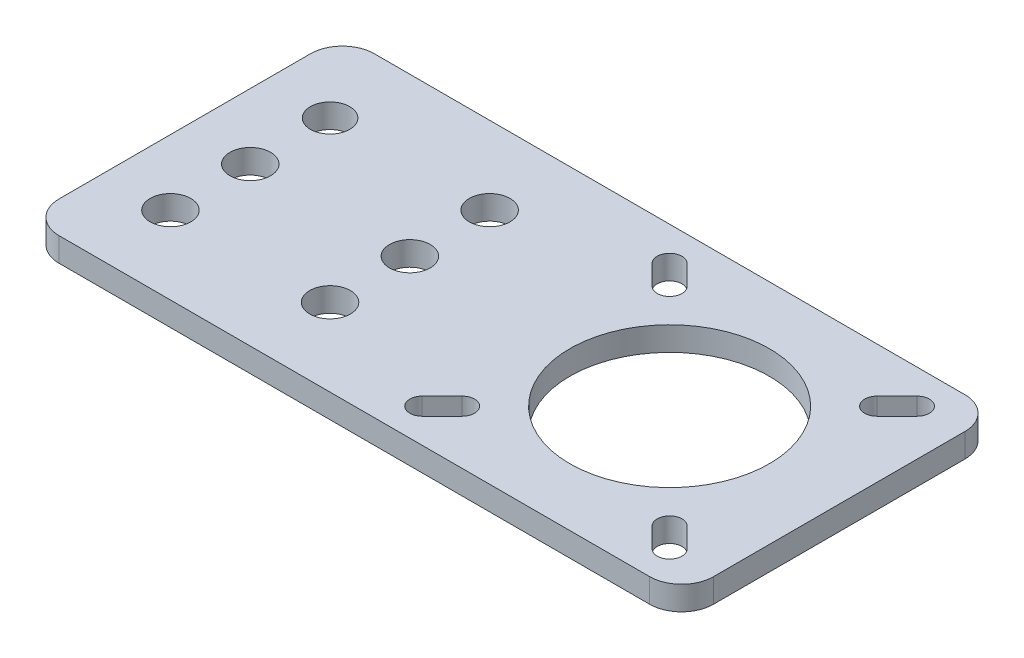
ISO-10303-21;
HEADER;
FILE_DESCRIPTION(('STEP AP214'),'2;1');
FILE_NAME('part.step','',(''),(''),'','','');
FILE_SCHEMA(('AUTOMOTIVE_DESIGN { 1 0 10303 214 1 1 1 1 }'));
ENDSEC;
DATA;
#1=APPLICATION_CONTEXT('core data for automotive mechanical design processes');
#2=APPLICATION_PROTOCOL_DEFINITION('international standard','automotive_design',2000,#1);
#3=PRODUCT_CONTEXT('',#1,'mechanical');
#4=PRODUCT('Part','Part','',(#3));
#5=PRODUCT_RELATED_PRODUCT_CATEGORY('part','',(#4));
#6=PRODUCT_DEFINITION_FORMATION('','',#4);
#7=PRODUCT_DEFINITION_CONTEXT('part definition',#1,'design');
#8=PRODUCT_DEFINITION('design','',#6,#7);
#9=PRODUCT_DEFINITION_SHAPE('','',#8);
#10=(LENGTH_UNIT() NAMED_UNIT(*) SI_UNIT(.MILLI.,.METRE.));
#11=(NAMED_UNIT(*) PLANE_ANGLE_UNIT() SI_UNIT($,.RADIAN.));
#12=(NAMED_UNIT(*) SI_UNIT($,.STERADIAN.) SOLID_ANGLE_UNIT());
#13=UNCERTAINTY_MEASURE_WITH_UNIT(LENGTH_MEASURE(1.E-05),#10,'distance_accuracy_value','');
#14=(GEOMETRIC_REPRESENTATION_CONTEXT(3) GLOBAL_UNCERTAINTY_ASSIGNED_CONTEXT((#13)) GLOBAL_UNIT_ASSIGNED_CONTEXT((#10,
#11,#12)) REPRESENTATION_CONTEXT('',''));
#15=CARTESIAN_POINT('',(0.,0.,0.));
#16=DIRECTION('',(0.,0.,1.));
#17=DIRECTION('',(1.,0.,0.));
#18=AXIS2_PLACEMENT_3D('',#15,#16,#17);
#19=CARTESIAN_POINT('',(-16.9138230966285,2.99999999999812,-24.8818430543195));
#20=DIRECTION('',(0.,1.,0.));
#21=DIRECTION('',(0.,0.,1.));
#22=AXIS2_PLACEMENT_3D('',#19,#20,#21);
#23=PLANE('',#22);
#24=DIRECTION('',(-0.707106781186549,0.,0.70710678118655));
#25=VECTOR('',#24,1.);
#26=CARTESIAN_POINT('',(54.2401613925318,2.99999999999812,-25.7278585651587));
#27=LINE('',#26,#25);
#28=CARTESIAN_POINT('',(54.2401613925318,2.99999999999812,-25.7278585651587));
#29=VERTEX_POINT('',#28);
#30=CARTESIAN_POINT('',(51.7401613925318,3.,-23.2278585651587));
#31=VERTEX_POINT('',#30);
#32=EDGE_CURVE('E601',#29,#31,#27,.T.);
#33=ORIENTED_EDGE('',*,*,#32,.F.);
#34=CARTESIAN_POINT('',(55.3361769033705,2.99999999999812,-24.6318430543195));
#35=DIRECTION('',(0.,1.,0.));
#36=DIRECTION('',(0.,0.,1.));
#37=AXIS2_PLACEMENT_3D('',#34,#35,#36);
#38=CIRCLE('',#37,1.55);
#39=CARTESIAN_POINT('',(56.4321924142097,3.,-23.5358275434812));
#40=VERTEX_POINT('',#39);
#41=EDGE_CURVE('E592',#40,#29,#38,.T.);
#42=ORIENTED_EDGE('',*,*,#41,.F.);
#43=DIRECTION('',(-0.707106781186553,0.,0.707106781186546));
#44=VECTOR('',#43,1.);
#45=CARTESIAN_POINT('',(56.4321924142097,3.,-23.5358275434812));
#46=LINE('',#45,#44);
#47=CARTESIAN_POINT('',(53.9321924142097,2.99999999999812,-21.0358275434803));
#48=VERTEX_POINT('',#47);
#49=EDGE_CURVE('E620',#40,#48,#46,.T.);
#50=ORIENTED_EDGE('',*,*,#49,.T.);
#51=CARTESIAN_POINT('',(52.8361769033705,3.,-22.1318430543204));
#52=DIRECTION('',(0.,1.,0.));
#53=DIRECTION('',(0.,0.,1.));
#54=AXIS2_PLACEMENT_3D('',#51,#52,#53);
#55=CIRCLE('',#54,1.54999999999999);
#56=EDGE_CURVE('E615',#31,#48,#55,.T.);
#57=ORIENTED_EDGE('',*,*,#56,.F.);
#58=EDGE_LOOP('',(#33,#42,#50,#57));
#59=FACE_BOUND('',#58,.T.);
#60=DIRECTION('',(0.707106781186542,0.,0.707106781186557));
#61=VECTOR('',#60,1.);
#62=CARTESIAN_POINT('',(23.2401613925324,2.99999999999812,-23.5358275434802));
#63=LINE('',#62,#61);
#64=CARTESIAN_POINT('',(23.2401613925324,2.99999999999812,-23.5358275434802));
#65=VERTEX_POINT('',#64);
#66=CARTESIAN_POINT('',(25.7401613925315,2.99999999999812,-21.0358275434802));
#67=VERTEX_POINT('',#66);
#68=EDGE_CURVE('E689',#65,#67,#63,.T.);
#69=ORIENTED_EDGE('',*,*,#68,.F.);
#70=CARTESIAN_POINT('',(24.3361769033698,3.,-24.6318430543193));
#71=DIRECTION('',(0.,1.,0.));
#72=DIRECTION('',(0.,0.,1.));
#73=AXIS2_PLACEMENT_3D('',#70,#71,#72);
#74=CIRCLE('',#73,1.55);
#75=CARTESIAN_POINT('',(25.4321924142099,2.99999999999812,-25.7278585651585));
#76=VERTEX_POINT('',#75);
#77=EDGE_CURVE('E686',#76,#65,#74,.T.);
#78=ORIENTED_EDGE('',*,*,#77,.F.);
#79=DIRECTION('',(0.707106781186539,0.,0.70710678118656));
#80=VECTOR('',#79,1.);
#81=CARTESIAN_POINT('',(25.4321924142099,2.99999999999812,-25.7278585651585));
#82=LINE('',#81,#80);
#83=CARTESIAN_POINT('',(27.9321924142098,3.,-23.2278585651594));
#84=VERTEX_POINT('',#83);
#85=EDGE_CURVE('E697',#76,#84,#82,.T.);
#86=ORIENTED_EDGE('',*,*,#85,.T.);
#87=CARTESIAN_POINT('',(26.8361769033697,3.,-22.1318430543193));
#88=DIRECTION('',(0.,1.,0.));
#89=DIRECTION('',(0.,0.,1.));
#90=AXIS2_PLACEMENT_3D('',#87,#88,#89);
#91=CIRCLE('',#90,1.54999999999999);
#92=EDGE_CURVE('E693',#67,#84,#91,.T.);
#93=ORIENTED_EDGE('',*,*,#92,.F.);
#94=EDGE_LOOP('',(#69,#78,#86,#93));
#95=FACE_BOUND('',#94,.T.);
#96=DIRECTION('',(0.707106781186554,0.,-0.707106781186545));
#97=VECTOR('',#96,1.);
#98=CARTESIAN_POINT('',(25.432192414209,2.99999999999812,7.46417245651987));
#99=LINE('',#98,#97);
#100=CARTESIAN_POINT('',(25.432192414209,2.99999999999812,7.46417245651987));
#101=VERTEX_POINT('',#100);
#102=CARTESIAN_POINT('',(27.9321924142099,3.,4.96417245651992));
#103=VERTEX_POINT('',#102);
#104=EDGE_CURVE('E733',#101,#103,#99,.T.);
#105=ORIENTED_EDGE('',*,*,#104,.F.);
#106=CARTESIAN_POINT('',(24.3361769033708,2.99999999999812,6.36815694568071));
#107=DIRECTION('',(0.,1.,0.));
#108=DIRECTION('',(0.,0.,1.));
#109=AXIS2_PLACEMENT_3D('',#106,#107,#108);
#110=CIRCLE('',#109,1.55);
#111=CARTESIAN_POINT('',(23.2401613925316,3.,5.27214143484062));
#112=VERTEX_POINT('',#111);
#113=EDGE_CURVE('E730',#112,#101,#110,.T.);
#114=ORIENTED_EDGE('',*,*,#113,.F.);
#115=DIRECTION('',(0.707106781186558,0.,-0.707106781186541));
#116=VECTOR('',#115,1.);
#117=CARTESIAN_POINT('',(23.2401613925316,3.,5.27214143484062));
#118=LINE('',#117,#116);
#119=CARTESIAN_POINT('',(25.7401613925307,2.99999999999812,2.77214143484067));
#120=VERTEX_POINT('',#119);
#121=EDGE_CURVE('E741',#112,#120,#118,.T.);
#122=ORIENTED_EDGE('',*,*,#121,.T.);
#123=CARTESIAN_POINT('',(26.8361769033699,3.,3.86815694568077));
#124=DIRECTION('',(0.,1.,0.));
#125=DIRECTION('',(0.,0.,1.));
#126=AXIS2_PLACEMENT_3D('',#123,#124,#125);
#127=CIRCLE('',#126,1.54999999999999);
#128=EDGE_CURVE('E737',#103,#120,#127,.T.);
#129=ORIENTED_EDGE('',*,*,#128,.F.);
#130=EDGE_LOOP('',(#105,#114,#122,#129));
#131=FACE_BOUND('',#130,.T.);
#132=CARTESIAN_POINT('',(7.28617690337052,2.99999999999812,-9.13184305431952));
#133=DIRECTION('',(0.,1.,0.));
#134=DIRECTION('',(0.,0.,1.));
#135=AXIS2_PLACEMENT_3D('',#132,#133,#134);
#136=CIRCLE('',#135,2.55);
#137=CARTESIAN_POINT('',(7.28617690337052,2.99999999999811,-6.58184305431951));
#138=VERTEX_POINT('',#137);
#139=EDGE_CURVE('E774',#138,#138,#136,.T.);
#140=ORIENTED_EDGE('',*,*,#139,.F.);
#141=EDGE_LOOP('',(#140));
#142=FACE_BOUND('',#141,.T.);
#143=CARTESIAN_POINT('',(-12.7138230966295,3.,0.868156945679543));
#144=DIRECTION('',(0.,1.,0.));
#145=DIRECTION('',(0.,0.,1.));
#146=AXIS2_PLACEMENT_3D('',#143,#144,#145);
#147=CIRCLE('',#146,2.55);
#148=CARTESIAN_POINT('',(-12.7138230966295,3.,3.41815694567955));
#149=VERTEX_POINT('',#148);
#150=EDGE_CURVE('E790',#149,#149,#147,.T.);
#151=ORIENTED_EDGE('',*,*,#150,.F.);
#152=EDGE_LOOP('',(#151));
#153=FACE_BOUND('',#152,.T.);
#154=CARTESIAN_POINT('',(-12.7138230966294,2.99999999999812,-19.1318430543204));
#155=DIRECTION('',(0.,1.,0.));
#156=DIRECTION('',(0.,0.,1.));
#157=AXIS2_PLACEMENT_3D('',#154,#155,#156);
#158=CIRCLE('',#157,2.46670415646697);
#159=CARTESIAN_POINT('',(-12.7138230966294,2.99999999999811,-16.6651388978534));
#160=VERTEX_POINT('',#159);
#161=EDGE_CURVE('E806',#160,#160,#158,.T.);
#162=ORIENTED_EDGE('',*,*,#161,.F.);
#163=EDGE_LOOP('',(#162));
#164=FACE_BOUND('',#163,.T.);
#165=CARTESIAN_POINT('',(-16.9138230966285,2.99999999999812,-24.8818430543195));
#166=DIRECTION('',(0.,1.,0.));
#167=DIRECTION('',(0.,0.,1.));
#168=AXIS2_PLACEMENT_3D('',#165,#166,#167);
#169=CIRCLE('',#168,4.);
#170=CARTESIAN_POINT('',(-16.9138230966295,3.,-28.8818430543195));
#171=VERTEX_POINT('',#170);
#172=CARTESIAN_POINT('',(-20.9138230966304,3.,-24.8818430543195));
#173=VERTEX_POINT('',#172);
#174=EDGE_CURVE('E822',#171,#173,#169,.T.);
#175=ORIENTED_EDGE('',*,*,#174,.T.);
#176=DIRECTION('',(0.,0.,1.));
#177=VECTOR('',#176,1.);
#178=CARTESIAN_POINT('',(-20.9138230966304,3.,-24.8818430543195));
#179=LINE('',#178,#177);
#180=CARTESIAN_POINT('',(-20.9138230966304,3.,6.61815694568052));
#181=VERTEX_POINT('',#180);
#182=EDGE_CURVE('E826',#173,#181,#179,.T.);
#183=ORIENTED_EDGE('',*,*,#182,.T.);
#184=CARTESIAN_POINT('',(-16.9138230966285,3.,6.61815694568046));
#185=DIRECTION('',(0.,-1.,0.));
#186=DIRECTION('',(0.,0.,-1.));
#187=AXIS2_PLACEMENT_3D('',#184,#185,#186);
#188=CIRCLE('',#187,4.);
#189=CARTESIAN_POINT('',(-16.9138230966295,3.,10.6181569456805));
#190=VERTEX_POINT('',#189);
#191=EDGE_CURVE('E830',#190,#181,#188,.T.);
#192=ORIENTED_EDGE('',*,*,#191,.F.);
#193=DIRECTION('',(1.,0.,0.));
#194=VECTOR('',#193,1.);
#195=CARTESIAN_POINT('',(-16.9138230966295,3.,10.6181569456805));
#196=LINE('',#195,#194);
#197=CARTESIAN_POINT('',(57.086176903371,3.,10.6181569456795));
#198=VERTEX_POINT('',#197);
#199=EDGE_CURVE('E834',#190,#198,#196,.T.);
#200=ORIENTED_EDGE('',*,*,#199,.T.);
#201=CARTESIAN_POINT('',(57.0861769033705,2.99999999999812,6.61815694568046));
#202=DIRECTION('',(0.,1.,0.));
#203=DIRECTION('',(0.,0.,1.));
#204=AXIS2_PLACEMENT_3D('',#201,#202,#203);
#205=CIRCLE('',#204,4.);
#206=CARTESIAN_POINT('',(61.0861769033705,2.99999999999812,6.61815694567958));
#207=VERTEX_POINT('',#206);
#208=EDGE_CURVE('E837',#198,#207,#205,.T.);
#209=ORIENTED_EDGE('',*,*,#208,.T.);
#210=DIRECTION('',(0.,0.,1.));
#211=VECTOR('',#210,1.);
#212=CARTESIAN_POINT('',(61.0861769033706,3.,-24.8818430543205));
#213=LINE('',#212,#211);
#214=CARTESIAN_POINT('',(61.0861769033706,3.,-24.8818430543205));
#215=VERTEX_POINT('',#214);
#216=EDGE_CURVE('E840',#215,#207,#213,.T.);
#217=ORIENTED_EDGE('',*,*,#216,.F.);
#218=CARTESIAN_POINT('',(57.086176903371,2.99999999999812,-24.8818430543204));
#219=DIRECTION('',(0.,1.,0.));
#220=DIRECTION('',(0.,0.,1.));
#221=AXIS2_PLACEMENT_3D('',#218,#219,#220);
#222=CIRCLE('',#221,4.);
#223=CARTESIAN_POINT('',(57.0861769033705,3.,-28.8818430543205));
#224=VERTEX_POINT('',#223);
#225=EDGE_CURVE('E844',#215,#224,#222,.T.);
#226=ORIENTED_EDGE('',*,*,#225,.T.);
#227=DIRECTION('',(1.,0.,0.));
#228=VECTOR('',#227,1.);
#229=CARTESIAN_POINT('',(-16.9138230966295,3.,-28.8818430543195));
#230=LINE('',#229,#228);
#231=EDGE_CURVE('E847',#171,#224,#230,.T.);
#232=ORIENTED_EDGE('',*,*,#231,.F.);
#233=EDGE_LOOP('',(#175,#183,#192,#200,#209,#217,#226,#232));
#234=FACE_BOUND('',#233,.T.);
#235=CARTESIAN_POINT('',(7.28617690337052,3.,-19.1318430543195));
#236=DIRECTION('',(0.,1.,0.));
#237=DIRECTION('',(0.,0.,1.));
#238=AXIS2_PLACEMENT_3D('',#235,#236,#237);
#239=CIRCLE('',#238,2.55);
#240=CARTESIAN_POINT('',(7.28617690337052,3.,-16.5818430543195));
#241=VERTEX_POINT('',#240);
#242=EDGE_CURVE('E814',#241,#241,#239,.T.);
#243=ORIENTED_EDGE('',*,*,#242,.F.);
#244=EDGE_LOOP('',(#243));
#245=FACE_BOUND('',#244,.T.);
#246=CARTESIAN_POINT('',(-12.7138230966295,3.,-9.13184305431952));
#247=DIRECTION('',(0.,1.,0.));
#248=DIRECTION('',(0.,0.,1.));
#249=AXIS2_PLACEMENT_3D('',#246,#247,#248);
#250=CIRCLE('',#249,2.55);
#251=CARTESIAN_POINT('',(-12.7138230966295,3.,-6.58184305431951));
#252=VERTEX_POINT('',#251);
#253=EDGE_CURVE('E798',#252,#252,#250,.T.);
#254=ORIENTED_EDGE('',*,*,#253,.F.);
#255=EDGE_LOOP('',(#254));
#256=FACE_BOUND('',#255,.T.);
#257=CARTESIAN_POINT('',(7.28617690337052,2.99999999999812,0.868156945680487));
#258=DIRECTION('',(0.,1.,0.));
#259=DIRECTION('',(0.,0.,1.));
#260=AXIS2_PLACEMENT_3D('',#257,#258,#259);
#261=CIRCLE('',#260,2.55);
#262=CARTESIAN_POINT('',(7.28617690337052,2.99999999999811,3.4181569456805));
#263=VERTEX_POINT('',#262);
#264=EDGE_CURVE('E782',#263,#263,#261,.T.);
#265=ORIENTED_EDGE('',*,*,#264,.F.);
#266=EDGE_LOOP('',(#265));
#267=FACE_BOUND('',#266,.T.);
#268=CARTESIAN_POINT('',(55.3361769033705,3.,6.36815694567955));
#269=DIRECTION('',(0.,-1.,0.));
#270=DIRECTION('',(0.,0.,-1.));
#271=AXIS2_PLACEMENT_3D('',#268,#269,#270);
#272=CIRCLE('',#271,1.54999999999999);
#273=CARTESIAN_POINT('',(56.4321924142097,2.99999999999812,5.27214143484134));
#274=VERTEX_POINT('',#273);
#275=CARTESIAN_POINT('',(54.2401613925318,2.99999999999812,7.46417245651959));
#276=VERTEX_POINT('',#275);
#277=EDGE_CURVE('E643',#274,#276,#272,.T.);
#278=ORIENTED_EDGE('',*,*,#277,.T.);
#279=DIRECTION('',(-0.707106781186549,0.,-0.70710678118655));
#280=VECTOR('',#279,1.);
#281=CARTESIAN_POINT('',(54.2401613925318,2.99999999999812,7.46417245651959));
#282=LINE('',#281,#280);
#283=CARTESIAN_POINT('',(51.7401613925319,3.,4.96417245651964));
#284=VERTEX_POINT('',#283);
#285=EDGE_CURVE('E647',#276,#284,#282,.T.);
#286=ORIENTED_EDGE('',*,*,#285,.T.);
#287=CARTESIAN_POINT('',(52.836176903371,2.99999999999812,3.86815694568049));
#288=DIRECTION('',(0.,-1.,0.));
#289=DIRECTION('',(0.,0.,-1.));
#290=AXIS2_PLACEMENT_3D('',#287,#288,#289);
#291=CIRCLE('',#290,1.54999999999999);
#292=CARTESIAN_POINT('',(53.9321924142097,2.99999999999812,2.77214143484134));
#293=VERTEX_POINT('',#292);
#294=EDGE_CURVE('E652',#284,#293,#291,.T.);
#295=ORIENTED_EDGE('',*,*,#294,.T.);
#296=DIRECTION('',(-0.707106781186549,0.,-0.70710678118655));
#297=VECTOR('',#296,1.);
#298=CARTESIAN_POINT('',(56.4321924142097,2.99999999999812,5.27214143484134));
#299=LINE('',#298,#297);
#300=EDGE_CURVE('E656',#274,#293,#299,.T.);
#301=ORIENTED_EDGE('',*,*,#300,.F.);
#302=EDGE_LOOP('',(#278,#286,#295,#301));
#303=FACE_BOUND('',#302,.T.);
#304=CARTESIAN_POINT('',(39.8361769033705,2.99999999999812,-9.13184305431952));
#305=DIRECTION('',(0.,1.,0.));
#306=DIRECTION('',(0.,0.,1.));
#307=AXIS2_PLACEMENT_3D('',#304,#305,#306);
#308=CIRCLE('',#307,12.5);
#309=CARTESIAN_POINT('',(39.8361769033705,2.99999999999808,3.36815694568053));
#310=VERTEX_POINT('',#309);
#311=EDGE_CURVE('E628',#310,#310,#308,.T.);
#312=ORIENTED_EDGE('',*,*,#311,.F.);
#313=EDGE_LOOP('',(#312));
#314=FACE_BOUND('',#313,.T.);
#315=ADVANCED_FACE('F430',(#59,#95,#131,#142,#153,#164,#234,#245,#256,#267,#303,#314),#23,.T.);
#316=CARTESIAN_POINT('',(-16.9138230966285,-1.88737914186277E-12,-24.8818430543186));
#317=DIRECTION('',(0.,1.,0.));
#318=DIRECTION('',(0.,0.,1.));
#319=AXIS2_PLACEMENT_3D('',#316,#317,#318);
#320=PLANE('',#319);
#321=CARTESIAN_POINT('',(24.3361769033698,0.,-24.6318430543184));
#322=DIRECTION('',(0.,1.,0.));
#323=DIRECTION('',(0.,0.,1.));
#324=AXIS2_PLACEMENT_3D('',#321,#322,#323);
#325=CIRCLE('',#324,1.55);
#326=CARTESIAN_POINT('',(25.4321924142099,-1.88737914186277E-12,-25.7278585651575));
#327=VERTEX_POINT('',#326);
#328=CARTESIAN_POINT('',(23.2401613925324,-1.88737914186277E-12,-23.5358275434802));
#329=VERTEX_POINT('',#328);
#330=EDGE_CURVE('E676',#327,#329,#325,.T.);
#331=ORIENTED_EDGE('',*,*,#330,.T.);
#332=DIRECTION('',(0.707106781186542,0.,0.707106781186557));
#333=VECTOR('',#332,1.);
#334=CARTESIAN_POINT('',(23.2401613925324,-1.88737914186277E-12,-23.5358275434802));
#335=LINE('',#334,#333);
#336=CARTESIAN_POINT('',(25.7401613925315,-1.88737914186277E-12,-21.0358275434792));
#337=VERTEX_POINT('',#336);
#338=EDGE_CURVE('E705',#329,#337,#335,.T.);
#339=ORIENTED_EDGE('',*,*,#338,.T.);
#340=CARTESIAN_POINT('',(26.8361769033697,0.,-22.1318430543184));
#341=DIRECTION('',(0.,1.,0.));
#342=DIRECTION('',(0.,0.,1.));
#343=AXIS2_PLACEMENT_3D('',#340,#341,#342);
#344=CIRCLE('',#343,1.54999999999999);
#345=CARTESIAN_POINT('',(27.9321924142098,0.,-23.2278585651584));
#346=VERTEX_POINT('',#345);
#347=EDGE_CURVE('E709',#337,#346,#344,.T.);
#348=ORIENTED_EDGE('',*,*,#347,.T.);
#349=DIRECTION('',(0.707106781186539,0.,0.70710678118656));
#350=VECTOR('',#349,1.);
#351=CARTESIAN_POINT('',(25.4321924142099,-1.88737914186277E-12,-25.7278585651575));
#352=LINE('',#351,#350);
#353=EDGE_CURVE('E690',#327,#346,#352,.T.);
#354=ORIENTED_EDGE('',*,*,#353,.F.);
#355=EDGE_LOOP('',(#331,#339,#348,#354));
#356=FACE_BOUND('',#355,.T.);
#357=CARTESIAN_POINT('',(7.28617690337052,-1.88737914186277E-12,-9.13184305431952));
#358=DIRECTION('',(0.,1.,0.));
#359=DIRECTION('',(0.,0.,1.));
#360=AXIS2_PLACEMENT_3D('',#357,#358,#359);
#361=CIRCLE('',#360,2.55);
#362=CARTESIAN_POINT('',(7.28617690337052,-1.8946002965091E-12,-6.58184305431951));
#363=VERTEX_POINT('',#362);
#364=EDGE_CURVE('E773',#363,#363,#361,.T.);
#365=ORIENTED_EDGE('',*,*,#364,.T.);
#366=EDGE_LOOP('',(#365));
#367=FACE_BOUND('',#366,.T.);
#368=CARTESIAN_POINT('',(7.28617690337052,-1.88737914186277E-12,0.868156945681375));
#369=DIRECTION('',(0.,1.,0.));
#370=DIRECTION('',(0.,0.,1.));
#371=AXIS2_PLACEMENT_3D('',#368,#369,#370);
#372=CIRCLE('',#371,2.55);
#373=CARTESIAN_POINT('',(7.28617690337052,-1.8946002965091E-12,3.41815694568139));
#374=VERTEX_POINT('',#373);
#375=EDGE_CURVE('E778',#374,#374,#372,.T.);
#376=ORIENTED_EDGE('',*,*,#375,.T.);
#377=EDGE_LOOP('',(#376));
#378=FACE_BOUND('',#377,.T.);
#379=CARTESIAN_POINT('',(-12.7138230966295,0.,0.868156945680487));
#380=DIRECTION('',(0.,1.,0.));
#381=DIRECTION('',(0.,0.,1.));
#382=AXIS2_PLACEMENT_3D('',#379,#380,#381);
#383=CIRCLE('',#382,2.55);
#384=CARTESIAN_POINT('',(-12.7138230966295,0.,3.4181569456805));
#385=VERTEX_POINT('',#384);
#386=EDGE_CURVE('E786',#385,#385,#383,.T.);
#387=ORIENTED_EDGE('',*,*,#386,.T.);
#388=EDGE_LOOP('',(#387));
#389=FACE_BOUND('',#388,.T.);
#390=CARTESIAN_POINT('',(-12.7138230966295,0.,-9.13184305431858));
#391=DIRECTION('',(0.,1.,0.));
#392=DIRECTION('',(0.,0.,1.));
#393=AXIS2_PLACEMENT_3D('',#390,#391,#392);
#394=CIRCLE('',#393,2.55);
#395=CARTESIAN_POINT('',(-12.7138230966295,0.,-6.58184305431857));
#396=VERTEX_POINT('',#395);
#397=EDGE_CURVE('E794',#396,#396,#394,.T.);
#398=ORIENTED_EDGE('',*,*,#397,.T.);
#399=EDGE_LOOP('',(#398));
#400=FACE_BOUND('',#399,.T.);
#401=CARTESIAN_POINT('',(-12.7138230966294,-1.88737914186277E-12,-19.1318430543195));
#402=DIRECTION('',(0.,1.,0.));
#403=DIRECTION('',(0.,0.,1.));
#404=AXIS2_PLACEMENT_3D('',#401,#402,#403);
#405=CIRCLE('',#404,2.46670415646697);
#406=CARTESIAN_POINT('',(-12.7138230966294,-1.89436441722771E-12,-16.6651388978526));
#407=VERTEX_POINT('',#406);
#408=EDGE_CURVE('E802',#407,#407,#405,.T.);
#409=ORIENTED_EDGE('',*,*,#408,.T.);
#410=EDGE_LOOP('',(#409));
#411=FACE_BOUND('',#410,.T.);
#412=CARTESIAN_POINT('',(7.28617690337052,0.,-19.1318430543185));
#413=DIRECTION('',(0.,1.,0.));
#414=DIRECTION('',(0.,0.,1.));
#415=AXIS2_PLACEMENT_3D('',#412,#413,#414);
#416=CIRCLE('',#415,2.55);
#417=CARTESIAN_POINT('',(7.28617690337052,0.,-16.5818430543185));
#418=VERTEX_POINT('',#417);
#419=EDGE_CURVE('E810',#418,#418,#416,.T.);
#420=ORIENTED_EDGE('',*,*,#419,.T.);
#421=EDGE_LOOP('',(#420));
#422=FACE_BOUND('',#421,.T.);
#423=CARTESIAN_POINT('',(-16.9138230966285,-1.88737914186277E-12,-24.8818430543186));
#424=DIRECTION('',(0.,1.,0.));
#425=DIRECTION('',(0.,0.,1.));
#426=AXIS2_PLACEMENT_3D('',#423,#424,#425);
#427=CIRCLE('',#426,4.);
#428=CARTESIAN_POINT('',(-16.9138230966295,0.,-28.8818430543186));
#429=VERTEX_POINT('',#428);
#430=CARTESIAN_POINT('',(-20.9138230966304,0.,-24.8818430543186));
#431=VERTEX_POINT('',#430);
#432=EDGE_CURVE('E818',#429,#431,#427,.T.);
#433=ORIENTED_EDGE('',*,*,#432,.F.);
#434=DIRECTION('',(1.,0.,0.));
#435=VECTOR('',#434,1.);
#436=CARTESIAN_POINT('',(-16.9138230966295,0.,-28.8818430543186));
#437=LINE('',#436,#435);
#438=CARTESIAN_POINT('',(57.0861769033705,0.,-28.8818430543195));
#439=VERTEX_POINT('',#438);
#440=EDGE_CURVE('E827',#429,#439,#437,.T.);
#441=ORIENTED_EDGE('',*,*,#440,.T.);
#442=CARTESIAN_POINT('',(57.086176903371,-1.88737914186277E-12,-24.8818430543195));
#443=DIRECTION('',(0.,1.,0.));
#444=DIRECTION('',(0.,0.,1.));
#445=AXIS2_PLACEMENT_3D('',#442,#443,#444);
#446=CIRCLE('',#445,4.);
#447=CARTESIAN_POINT('',(61.0861769033706,0.,-24.8818430543195));
#448=VERTEX_POINT('',#447);
#449=EDGE_CURVE('E874',#448,#439,#446,.T.);
#450=ORIENTED_EDGE('',*,*,#449,.F.);
#451=DIRECTION('',(0.,0.,1.));
#452=VECTOR('',#451,1.);
#453=CARTESIAN_POINT('',(61.0861769033706,0.,-24.8818430543195));
#454=LINE('',#453,#452);
#455=CARTESIAN_POINT('',(61.0861769033705,-1.88737914186277E-12,6.61815694568052));
#456=VERTEX_POINT('',#455);
#457=EDGE_CURVE('E870',#448,#456,#454,.T.);
#458=ORIENTED_EDGE('',*,*,#457,.T.);
#459=CARTESIAN_POINT('',(57.0861769033705,-1.88737914186277E-12,6.61815694568052));
#460=DIRECTION('',(0.,1.,0.));
#461=DIRECTION('',(0.,0.,1.));
#462=AXIS2_PLACEMENT_3D('',#459,#460,#461);
#463=CIRCLE('',#462,4.);
#464=CARTESIAN_POINT('',(57.086176903371,0.,10.6181569456805));
#465=VERTEX_POINT('',#464);
#466=EDGE_CURVE('E866',#465,#456,#463,.T.);
#467=ORIENTED_EDGE('',*,*,#466,.F.);
#468=DIRECTION('',(1.,0.,0.));
#469=VECTOR('',#468,1.);
#470=CARTESIAN_POINT('',(-16.9138230966295,0.,10.6181569456815));
#471=LINE('',#470,#469);
#472=CARTESIAN_POINT('',(-16.9138230966295,0.,10.6181569456815));
#473=VERTEX_POINT('',#472);
#474=EDGE_CURVE('E863',#473,#465,#471,.T.);
#475=ORIENTED_EDGE('',*,*,#474,.F.);
#476=CARTESIAN_POINT('',(-16.9138230966285,0.,6.61815694568141));
#477=DIRECTION('',(0.,-1.,0.));
#478=DIRECTION('',(0.,0.,-1.));
#479=AXIS2_PLACEMENT_3D('',#476,#477,#478);
#480=CIRCLE('',#479,4.);
#481=CARTESIAN_POINT('',(-20.9138230966304,0.,6.61815694568146));
#482=VERTEX_POINT('',#481);
#483=EDGE_CURVE('E859',#473,#482,#480,.T.);
#484=ORIENTED_EDGE('',*,*,#483,.T.);
#485=DIRECTION('',(0.,0.,1.));
#486=VECTOR('',#485,1.);
#487=CARTESIAN_POINT('',(-20.9138230966304,0.,-24.8818430543186));
#488=LINE('',#487,#486);
#489=EDGE_CURVE('E855',#431,#482,#488,.T.);
#490=ORIENTED_EDGE('',*,*,#489,.F.);
#491=EDGE_LOOP('',(#433,#441,#450,#458,#467,#475,#484,#490));
#492=FACE_BOUND('',#491,.T.);
#493=CARTESIAN_POINT('',(24.3361769033708,-1.88737914186277E-12,6.36815694568166));
#494=DIRECTION('',(0.,1.,0.));
#495=DIRECTION('',(0.,0.,1.));
#496=AXIS2_PLACEMENT_3D('',#493,#494,#495);
#497=CIRCLE('',#496,1.55);
#498=CARTESIAN_POINT('',(23.2401613925316,0.,5.27214143484156));
#499=VERTEX_POINT('',#498);
#500=CARTESIAN_POINT('',(25.432192414209,-1.88737914186277E-12,7.46417245652081));
#501=VERTEX_POINT('',#500);
#502=EDGE_CURVE('E729',#499,#501,#497,.T.);
#503=ORIENTED_EDGE('',*,*,#502,.T.);
#504=DIRECTION('',(0.707106781186554,0.,-0.707106781186545));
#505=VECTOR('',#504,1.);
#506=CARTESIAN_POINT('',(25.432192414209,-1.88737914186277E-12,7.46417245652081));
#507=LINE('',#506,#505);
#508=CARTESIAN_POINT('',(27.9321924142099,0.,4.96417245652081));
#509=VERTEX_POINT('',#508);
#510=EDGE_CURVE('E749',#501,#509,#507,.T.);
#511=ORIENTED_EDGE('',*,*,#510,.T.);
#512=CARTESIAN_POINT('',(26.8361769033699,0.,3.86815694568171));
#513=DIRECTION('',(0.,1.,0.));
#514=DIRECTION('',(0.,0.,1.));
#515=AXIS2_PLACEMENT_3D('',#512,#513,#514);
#516=CIRCLE('',#515,1.54999999999999);
#517=CARTESIAN_POINT('',(25.7401613925307,-1.88737914186277E-12,2.77214143484161));
#518=VERTEX_POINT('',#517);
#519=EDGE_CURVE('E753',#509,#518,#516,.T.);
#520=ORIENTED_EDGE('',*,*,#519,.T.);
#521=DIRECTION('',(0.707106781186558,0.,-0.707106781186541));
#522=VECTOR('',#521,1.);
#523=CARTESIAN_POINT('',(23.2401613925316,0.,5.27214143484156));
#524=LINE('',#523,#522);
#525=EDGE_CURVE('E734',#499,#518,#524,.T.);
#526=ORIENTED_EDGE('',*,*,#525,.F.);
#527=EDGE_LOOP('',(#503,#511,#520,#526));
#528=FACE_BOUND('',#527,.T.);
#529=DIRECTION('',(-0.707106781186549,0.,-0.70710678118655));
#530=VECTOR('',#529,1.);
#531=CARTESIAN_POINT('',(54.2401613925318,-1.88737914186277E-12,7.46417245651965));
#532=LINE('',#531,#530);
#533=CARTESIAN_POINT('',(54.2401613925318,-1.88737914186277E-12,7.46417245651965));
#534=VERTEX_POINT('',#533);
#535=CARTESIAN_POINT('',(51.7401613925318,0.,4.96417245652059));
#536=VERTEX_POINT('',#535);
#537=EDGE_CURVE('E662',#534,#536,#532,.T.);
#538=ORIENTED_EDGE('',*,*,#537,.F.);
#539=CARTESIAN_POINT('',(55.3361769033705,0.,6.36815694568049));
#540=DIRECTION('',(0.,-1.,0.));
#541=DIRECTION('',(0.,0.,-1.));
#542=AXIS2_PLACEMENT_3D('',#539,#540,#541);
#543=CIRCLE('',#542,1.54999999999999);
#544=CARTESIAN_POINT('',(56.4321924142097,-1.88737914186277E-12,5.27214143484228));
#545=VERTEX_POINT('',#544);
#546=EDGE_CURVE('E610',#545,#534,#543,.T.);
#547=ORIENTED_EDGE('',*,*,#546,.F.);
#548=DIRECTION('',(-0.707106781186549,0.,-0.70710678118655));
#549=VECTOR('',#548,1.);
#550=CARTESIAN_POINT('',(56.4321924142097,-1.88737914186277E-12,5.27214143484228));
#551=LINE('',#550,#549);
#552=CARTESIAN_POINT('',(53.9321924142097,-1.88737914186277E-12,2.77214143484134));
#553=VERTEX_POINT('',#552);
#554=EDGE_CURVE('E648',#545,#553,#551,.T.);
#555=ORIENTED_EDGE('',*,*,#554,.T.);
#556=CARTESIAN_POINT('',(52.836176903371,-1.88737914186277E-12,3.86815694568143));
#557=DIRECTION('',(0.,-1.,0.));
#558=DIRECTION('',(0.,0.,-1.));
#559=AXIS2_PLACEMENT_3D('',#556,#557,#558);
#560=CIRCLE('',#559,1.54999999999999);
#561=EDGE_CURVE('E666',#536,#553,#560,.T.);
#562=ORIENTED_EDGE('',*,*,#561,.F.);
#563=EDGE_LOOP('',(#538,#547,#555,#562));
#564=FACE_BOUND('',#563,.T.);
#565=CARTESIAN_POINT('',(55.3361769033705,-1.88737914186277E-12,-24.6318430543195));
#566=DIRECTION('',(0.,1.,0.));
#567=DIRECTION('',(0.,0.,1.));
#568=AXIS2_PLACEMENT_3D('',#565,#566,#567);
#569=CIRCLE('',#568,1.55);
#570=CARTESIAN_POINT('',(56.4321924142097,0.,-23.5358275434803));
#571=VERTEX_POINT('',#570);
#572=CARTESIAN_POINT('',(54.2401613925318,-1.88737914186277E-12,-25.7278585651577));
#573=VERTEX_POINT('',#572);
#574=EDGE_CURVE('E454',#571,#573,#569,.T.);
#575=ORIENTED_EDGE('',*,*,#574,.T.);
#576=DIRECTION('',(-0.707106781186549,0.,0.70710678118655));
#577=VECTOR('',#576,1.);
#578=CARTESIAN_POINT('',(54.2401613925318,-1.88737914186277E-12,-25.7278585651577));
#579=LINE('',#578,#577);
#580=CARTESIAN_POINT('',(51.7401613925318,0.,-23.2278585651586));
#581=VERTEX_POINT('',#580);
#582=EDGE_CURVE('E608',#573,#581,#579,.T.);
#583=ORIENTED_EDGE('',*,*,#582,.T.);
#584=CARTESIAN_POINT('',(52.8361769033705,0.,-22.1318430543195));
#585=DIRECTION('',(0.,1.,0.));
#586=DIRECTION('',(0.,0.,1.));
#587=AXIS2_PLACEMENT_3D('',#584,#585,#586);
#588=CIRCLE('',#587,1.54999999999999);
#589=CARTESIAN_POINT('',(53.9321924142097,-1.88737914186277E-12,-21.0358275434794));
#590=VERTEX_POINT('',#589);
#591=EDGE_CURVE('E631',#581,#590,#588,.T.);
#592=ORIENTED_EDGE('',*,*,#591,.T.);
#593=DIRECTION('',(-0.707106781186553,0.,0.707106781186546));
#594=VECTOR('',#593,1.);
#595=CARTESIAN_POINT('',(56.4321924142097,0.,-23.5358275434803));
#596=LINE('',#595,#594);
#597=EDGE_CURVE('E602',#571,#590,#596,.T.);
#598=ORIENTED_EDGE('',*,*,#597,.F.);
#599=EDGE_LOOP('',(#575,#583,#592,#598));
#600=FACE_BOUND('',#599,.T.);
#601=CARTESIAN_POINT('',(39.8361769033705,-1.88737914186277E-12,-9.13184305431858));
#602=DIRECTION('',(0.,1.,0.));
#603=DIRECTION('',(0.,0.,1.));
#604=AXIS2_PLACEMENT_3D('',#601,#602,#603);
#605=CIRCLE('',#604,12.5);
#606=CARTESIAN_POINT('',(39.8361769033705,-1.92277695875658E-12,3.36815694568147));
#607=VERTEX_POINT('',#606);
#608=EDGE_CURVE('E985',#607,#607,#605,.T.);
#609=ORIENTED_EDGE('',*,*,#608,.T.);
#610=EDGE_LOOP('',(#609));
#611=FACE_BOUND('',#610,.T.);
#612=ADVANCED_FACE('F911',(#356,#367,#378,#389,#400,#411,#422,#492,#528,#564,#600,#611),#320,.F.);
#613=CARTESIAN_POINT('',(-16.9138230966285,2.99999999999812,-24.8818430543195));
#614=DIRECTION('',(0.,-1.,0.));
#615=DIRECTION('',(0.,0.,-1.));
#616=AXIS2_PLACEMENT_3D('',#613,#614,#615);
#617=CYLINDRICAL_SURFACE('',#616,4.);
#618=ORIENTED_EDGE('',*,*,#432,.T.);
#619=DIRECTION('',(0.,-1.,0.));
#620=VECTOR('',#619,1.);
#621=CARTESIAN_POINT('',(-20.9138230966304,3.,-24.8818430543195));
#622=LINE('',#621,#620);
#623=EDGE_CURVE('E12',#173,#431,#622,.T.);
#624=ORIENTED_EDGE('',*,*,#623,.F.);
#625=ORIENTED_EDGE('',*,*,#174,.F.);
#626=DIRECTION('',(0.,-1.,0.));
#627=VECTOR('',#626,1.);
#628=CARTESIAN_POINT('',(-16.9138230966295,3.,-28.8818430543195));
#629=LINE('',#628,#627);
#630=EDGE_CURVE('E851',#171,#429,#629,.T.);
#631=ORIENTED_EDGE('',*,*,#630,.T.);
#632=EDGE_LOOP('',(#618,#624,#625,#631));
#633=FACE_BOUND('',#632,.T.);
#634=ADVANCED_FACE('F432',(#633),#617,.T.);
#635=CARTESIAN_POINT('',(-20.9138230966304,3.,-24.8818430543195));
#636=DIRECTION('',(1.,0.,0.));
#637=DIRECTION('',(0.,0.,-1.));
#638=AXIS2_PLACEMENT_3D('',#635,#636,#637);
#639=PLANE('',#638);
#640=ORIENTED_EDGE('',*,*,#489,.T.);
#641=DIRECTION('',(0.,-1.,0.));
#642=VECTOR('',#641,1.);
#643=CARTESIAN_POINT('',(-20.9138230966304,3.,6.61815694568052));
#644=LINE('',#643,#642);
#645=EDGE_CURVE('E439',#181,#482,#644,.T.);
#646=ORIENTED_EDGE('',*,*,#645,.F.);
#647=ORIENTED_EDGE('',*,*,#182,.F.);
#648=ORIENTED_EDGE('',*,*,#623,.T.);
#649=EDGE_LOOP('',(#640,#646,#647,#648));
#650=FACE_BOUND('',#649,.T.);
#651=ADVANCED_FACE('F906',(#650),#639,.F.);
#652=CARTESIAN_POINT('',(-16.9138230966285,3.,6.61815694568046));
#653=DIRECTION('',(0.,-1.,0.));
#654=DIRECTION('',(0.,0.,-1.));
#655=AXIS2_PLACEMENT_3D('',#652,#653,#654);
#656=CYLINDRICAL_SURFACE('',#655,4.);
#657=ORIENTED_EDGE('',*,*,#483,.F.);
#658=DIRECTION('',(0.,-1.,0.));
#659=VECTOR('',#658,1.);
#660=CARTESIAN_POINT('',(-16.9138230966295,3.,10.6181569456805));
#661=LINE('',#660,#659);
#662=EDGE_CURVE('E896',#190,#473,#661,.T.);
#663=ORIENTED_EDGE('',*,*,#662,.F.);
#664=ORIENTED_EDGE('',*,*,#191,.T.);
#665=ORIENTED_EDGE('',*,*,#645,.T.);
#666=EDGE_LOOP('',(#657,#663,#664,#665));
#667=FACE_BOUND('',#666,.T.);
#668=ADVANCED_FACE('F903',(#667),#656,.T.);
#669=CARTESIAN_POINT('',(-16.9138230966295,3.,10.6181569456805));
#670=DIRECTION('',(0.,0.,-1.));
#671=DIRECTION('',(-1.,0.,0.));
#672=AXIS2_PLACEMENT_3D('',#669,#670,#671);
#673=PLANE('',#672);
#674=ORIENTED_EDGE('',*,*,#474,.T.);
#675=DIRECTION('',(0.,-1.,0.));
#676=VECTOR('',#675,1.);
#677=CARTESIAN_POINT('',(57.086176903371,3.,10.6181569456795));
#678=LINE('',#677,#676);
#679=EDGE_CURVE('E892',#198,#465,#678,.T.);
#680=ORIENTED_EDGE('',*,*,#679,.F.);
#681=ORIENTED_EDGE('',*,*,#199,.F.);
#682=ORIENTED_EDGE('',*,*,#662,.T.);
#683=EDGE_LOOP('',(#674,#680,#681,#682));
#684=FACE_BOUND('',#683,.T.);
#685=ADVANCED_FACE('F916',(#684),#673,.F.);
#686=CARTESIAN_POINT('',(57.0861769033705,2.99999999999812,6.61815694568046));
#687=DIRECTION('',(0.,-1.,0.));
#688=DIRECTION('',(0.,0.,-1.));
#689=AXIS2_PLACEMENT_3D('',#686,#687,#688);
#690=CYLINDRICAL_SURFACE('',#689,4.);
#691=ORIENTED_EDGE('',*,*,#466,.T.);
#692=DIRECTION('',(0.,-1.,0.));
#693=VECTOR('',#692,1.);
#694=CARTESIAN_POINT('',(61.0861769033705,2.99999999999812,6.61815694567958));
#695=LINE('',#694,#693);
#696=EDGE_CURVE('E889',#207,#456,#695,.T.);
#697=ORIENTED_EDGE('',*,*,#696,.F.);
#698=ORIENTED_EDGE('',*,*,#208,.F.);
#699=ORIENTED_EDGE('',*,*,#679,.T.);
#700=EDGE_LOOP('',(#691,#697,#698,#699));
#701=FACE_BOUND('',#700,.T.);
#702=ADVANCED_FACE('F920',(#701),#690,.T.);
#703=CARTESIAN_POINT('',(61.0861769033706,3.,-24.8818430543205));
#704=DIRECTION('',(1.,0.,0.));
#705=DIRECTION('',(0.,0.,-1.));
#706=AXIS2_PLACEMENT_3D('',#703,#704,#705);
#707=PLANE('',#706);
#708=ORIENTED_EDGE('',*,*,#457,.F.);
#709=DIRECTION('',(0.,-1.,0.));
#710=VECTOR('',#709,1.);
#711=CARTESIAN_POINT('',(61.0861769033706,3.,-24.8818430543205));
#712=LINE('',#711,#710);
#713=EDGE_CURVE('E886',#215,#448,#712,.T.);
#714=ORIENTED_EDGE('',*,*,#713,.F.);
#715=ORIENTED_EDGE('',*,*,#216,.T.);
#716=ORIENTED_EDGE('',*,*,#696,.T.);
#717=EDGE_LOOP('',(#708,#714,#715,#716));
#718=FACE_BOUND('',#717,.T.);
#719=ADVANCED_FACE('F938',(#718),#707,.T.);
#720=CARTESIAN_POINT('',(57.086176903371,2.99999999999812,-24.8818430543204));
#721=DIRECTION('',(0.,-1.,0.));
#722=DIRECTION('',(0.,0.,-1.));
#723=AXIS2_PLACEMENT_3D('',#720,#721,#722);
#724=CYLINDRICAL_SURFACE('',#723,4.);
#725=ORIENTED_EDGE('',*,*,#449,.T.);
#726=DIRECTION('',(0.,-1.,0.));
#727=VECTOR('',#726,1.);
#728=CARTESIAN_POINT('',(57.0861769033705,3.,-28.8818430543205));
#729=LINE('',#728,#727);
#730=EDGE_CURVE('E883',#224,#439,#729,.T.);
#731=ORIENTED_EDGE('',*,*,#730,.F.);
#732=ORIENTED_EDGE('',*,*,#225,.F.);
#733=ORIENTED_EDGE('',*,*,#713,.T.);
#734=EDGE_LOOP('',(#725,#731,#732,#733));
#735=FACE_BOUND('',#734,.T.);
#736=ADVANCED_FACE('F935',(#735),#724,.T.);
#737=CARTESIAN_POINT('',(-16.9138230966295,3.,-28.8818430543195));
#738=DIRECTION('',(0.,0.,-1.));
#739=DIRECTION('',(-1.,0.,0.));
#740=AXIS2_PLACEMENT_3D('',#737,#738,#739);
#741=PLANE('',#740);
#742=ORIENTED_EDGE('',*,*,#440,.F.);
#743=ORIENTED_EDGE('',*,*,#630,.F.);
#744=ORIENTED_EDGE('',*,*,#231,.T.);
#745=ORIENTED_EDGE('',*,*,#730,.T.);
#746=EDGE_LOOP('',(#742,#743,#744,#745));
#747=FACE_BOUND('',#746,.T.);
#748=ADVANCED_FACE('F931',(#747),#741,.T.);
#749=CARTESIAN_POINT('',(7.28617690337052,3.,-19.1318430543195));
#750=DIRECTION('',(0.,-1.,0.));
#751=DIRECTION('',(0.,0.,-1.));
#752=AXIS2_PLACEMENT_3D('',#749,#750,#751);
#753=CYLINDRICAL_SURFACE('',#752,2.55);
#754=ORIENTED_EDGE('',*,*,#242,.T.);
#755=EDGE_LOOP('',(#754));
#756=FACE_BOUND('',#755,.T.);
#757=ORIENTED_EDGE('',*,*,#419,.F.);
#758=EDGE_LOOP('',(#757));
#759=FACE_BOUND('',#758,.T.);
#760=ADVANCED_FACE('F955',(#756,#759),#753,.F.);
#761=CARTESIAN_POINT('',(-12.7138230966294,2.99999999999812,-19.1318430543204));
#762=DIRECTION('',(0.,-1.,0.));
#763=DIRECTION('',(0.,0.,-1.));
#764=AXIS2_PLACEMENT_3D('',#761,#762,#763);
#765=CYLINDRICAL_SURFACE('',#764,2.46670415646697);
#766=ORIENTED_EDGE('',*,*,#161,.T.);
#767=EDGE_LOOP('',(#766));
#768=FACE_BOUND('',#767,.T.);
#769=ORIENTED_EDGE('',*,*,#408,.F.);
#770=EDGE_LOOP('',(#769));
#771=FACE_BOUND('',#770,.T.);
#772=ADVANCED_FACE('F962',(#768,#771),#765,.F.);
#773=CARTESIAN_POINT('',(-12.7138230966295,3.,-9.13184305431952));
#774=DIRECTION('',(0.,-1.,0.));
#775=DIRECTION('',(0.,0.,-1.));
#776=AXIS2_PLACEMENT_3D('',#773,#774,#775);
#777=CYLINDRICAL_SURFACE('',#776,2.55);
#778=ORIENTED_EDGE('',*,*,#253,.T.);
#779=EDGE_LOOP('',(#778));
#780=FACE_BOUND('',#779,.T.);
#781=ORIENTED_EDGE('',*,*,#397,.F.);
#782=EDGE_LOOP('',(#781));
#783=FACE_BOUND('',#782,.T.);
#784=ADVANCED_FACE('F967',(#780,#783),#777,.F.);
#785=CARTESIAN_POINT('',(-12.7138230966295,3.,0.868156945679543));
#786=DIRECTION('',(0.,-1.,0.));
#787=DIRECTION('',(0.,0.,-1.));
#788=AXIS2_PLACEMENT_3D('',#785,#786,#787);
#789=CYLINDRICAL_SURFACE('',#788,2.55);
#790=ORIENTED_EDGE('',*,*,#150,.T.);
#791=EDGE_LOOP('',(#790));
#792=FACE_BOUND('',#791,.T.);
#793=ORIENTED_EDGE('',*,*,#386,.F.);
#794=EDGE_LOOP('',(#793));
#795=FACE_BOUND('',#794,.T.);
#796=ADVANCED_FACE('F1066',(#792,#795),#789,.F.);
#797=CARTESIAN_POINT('',(7.28617690337052,2.99999999999812,0.868156945680487));
#798=DIRECTION('',(0.,-1.,0.));
#799=DIRECTION('',(0.,0.,-1.));
#800=AXIS2_PLACEMENT_3D('',#797,#798,#799);
#801=CYLINDRICAL_SURFACE('',#800,2.55);
#802=ORIENTED_EDGE('',*,*,#264,.T.);
#803=EDGE_LOOP('',(#802));
#804=FACE_BOUND('',#803,.T.);
#805=ORIENTED_EDGE('',*,*,#375,.F.);
#806=EDGE_LOOP('',(#805));
#807=FACE_BOUND('',#806,.T.);
#808=ADVANCED_FACE('F1062',(#804,#807),#801,.F.);
#809=CARTESIAN_POINT('',(7.28617690337052,2.99999999999812,-9.13184305431952));
#810=DIRECTION('',(0.,-1.,0.));
#811=DIRECTION('',(0.,0.,-1.));
#812=AXIS2_PLACEMENT_3D('',#809,#810,#811);
#813=CYLINDRICAL_SURFACE('',#812,2.55);
#814=ORIENTED_EDGE('',*,*,#139,.T.);
#815=EDGE_LOOP('',(#814));
#816=FACE_BOUND('',#815,.T.);
#817=ORIENTED_EDGE('',*,*,#364,.F.);
#818=EDGE_LOOP('',(#817));
#819=FACE_BOUND('',#818,.T.);
#820=ADVANCED_FACE('F1058',(#816,#819),#813,.F.);
#821=CARTESIAN_POINT('',(24.3361769033708,2.99999999999812,6.36815694568071));
#822=DIRECTION('',(0.,-1.,0.));
#823=DIRECTION('',(0.,0.,-1.));
#824=AXIS2_PLACEMENT_3D('',#821,#822,#823);
#825=CYLINDRICAL_SURFACE('',#824,1.55);
#826=ORIENTED_EDGE('',*,*,#502,.F.);
#827=DIRECTION('',(0.,-1.,0.));
#828=VECTOR('',#827,1.);
#829=CARTESIAN_POINT('',(23.2401613925316,3.,5.27214143484062));
#830=LINE('',#829,#828);
#831=EDGE_CURVE('E745',#112,#499,#830,.T.);
#832=ORIENTED_EDGE('',*,*,#831,.F.);
#833=ORIENTED_EDGE('',*,*,#113,.T.);
#834=DIRECTION('',(0.,-1.,0.));
#835=VECTOR('',#834,1.);
#836=CARTESIAN_POINT('',(25.432192414209,2.99999999999812,7.46417245651987));
#837=LINE('',#836,#835);
#838=EDGE_CURVE('E769',#101,#501,#837,.T.);
#839=ORIENTED_EDGE('',*,*,#838,.T.);
#840=EDGE_LOOP('',(#826,#832,#833,#839));
#841=FACE_BOUND('',#840,.T.);
#842=ADVANCED_FACE('F1054',(#841),#825,.F.);
#843=CARTESIAN_POINT('',(25.432192414209,2.99999999999812,7.46417245651987));
#844=DIRECTION('',(-0.707106781186544,0.,-0.707106781186554));
#845=DIRECTION('',(-0.707106781186554,0.,0.707106781186545));
#846=AXIS2_PLACEMENT_3D('',#843,#844,#845);
#847=PLANE('',#846);
#848=ORIENTED_EDGE('',*,*,#510,.F.);
#849=ORIENTED_EDGE('',*,*,#838,.F.);
#850=ORIENTED_EDGE('',*,*,#104,.T.);
#851=DIRECTION('',(0.,-1.,0.));
#852=VECTOR('',#851,1.);
#853=CARTESIAN_POINT('',(27.9321924142099,3.,4.96417245651992));
#854=LINE('',#853,#852);
#855=EDGE_CURVE('E766',#103,#509,#854,.T.);
#856=ORIENTED_EDGE('',*,*,#855,.T.);
#857=EDGE_LOOP('',(#848,#849,#850,#856));
#858=FACE_BOUND('',#857,.T.);
#859=ADVANCED_FACE('F1050',(#858),#847,.T.);
#860=CARTESIAN_POINT('',(26.8361769033699,3.,3.86815694568077));
#861=DIRECTION('',(0.,-1.,0.));
#862=DIRECTION('',(0.,0.,-1.));
#863=AXIS2_PLACEMENT_3D('',#860,#861,#862);
#864=CYLINDRICAL_SURFACE('',#863,1.54999999999999);
#865=ORIENTED_EDGE('',*,*,#519,.F.);
#866=ORIENTED_EDGE('',*,*,#855,.F.);
#867=ORIENTED_EDGE('',*,*,#128,.T.);
#868=DIRECTION('',(0.,-1.,0.));
#869=VECTOR('',#868,1.);
#870=CARTESIAN_POINT('',(25.7401613925307,2.99999999999812,2.77214143484067));
#871=LINE('',#870,#869);
#872=EDGE_CURVE('E763',#120,#518,#871,.T.);
#873=ORIENTED_EDGE('',*,*,#872,.T.);
#874=EDGE_LOOP('',(#865,#866,#867,#873));
#875=FACE_BOUND('',#874,.T.);
#876=ADVANCED_FACE('F1046',(#875),#864,.F.);
#877=CARTESIAN_POINT('',(23.2401613925316,3.,5.27214143484062));
#878=DIRECTION('',(-0.707106781186541,0.,-0.707106781186558));
#879=DIRECTION('',(-0.707106781186558,0.,0.707106781186541));
#880=AXIS2_PLACEMENT_3D('',#877,#878,#879);
#881=PLANE('',#880);
#882=ORIENTED_EDGE('',*,*,#525,.T.);
#883=ORIENTED_EDGE('',*,*,#872,.F.);
#884=ORIENTED_EDGE('',*,*,#121,.F.);
#885=ORIENTED_EDGE('',*,*,#831,.T.);
#886=EDGE_LOOP('',(#882,#883,#884,#885));
#887=FACE_BOUND('',#886,.T.);
#888=ADVANCED_FACE('F1042',(#887),#881,.F.);
#889=CARTESIAN_POINT('',(24.3361769033698,3.,-24.6318430543193));
#890=DIRECTION('',(0.,-1.,0.));
#891=DIRECTION('',(0.,0.,-1.));
#892=AXIS2_PLACEMENT_3D('',#889,#890,#891);
#893=CYLINDRICAL_SURFACE('',#892,1.55);
#894=ORIENTED_EDGE('',*,*,#330,.F.);
#895=DIRECTION('',(0.,-1.,0.));
#896=VECTOR('',#895,1.);
#897=CARTESIAN_POINT('',(25.4321924142099,2.99999999999812,-25.7278585651585));
#898=LINE('',#897,#896);
#899=EDGE_CURVE('E701',#76,#327,#898,.T.);
#900=ORIENTED_EDGE('',*,*,#899,.F.);
#901=ORIENTED_EDGE('',*,*,#77,.T.);
#902=DIRECTION('',(0.,-1.,0.));
#903=VECTOR('',#902,1.);
#904=CARTESIAN_POINT('',(23.2401613925324,2.99999999999812,-23.5358275434802));
#905=LINE('',#904,#903);
#906=EDGE_CURVE('E725',#65,#329,#905,.T.);
#907=ORIENTED_EDGE('',*,*,#906,.T.);
#908=EDGE_LOOP('',(#894,#900,#901,#907));
#909=FACE_BOUND('',#908,.T.);
#910=ADVANCED_FACE('F1038',(#909),#893,.F.);
#911=CARTESIAN_POINT('',(23.2401613925324,2.99999999999812,-23.5358275434802));
#912=DIRECTION('',(0.707106781186557,0.,-0.707106781186542));
#913=DIRECTION('',(-0.707106781186542,0.,-0.707106781186557));
#914=AXIS2_PLACEMENT_3D('',#911,#912,#913);
#915=PLANE('',#914);
#916=ORIENTED_EDGE('',*,*,#338,.F.);
#917=ORIENTED_EDGE('',*,*,#906,.F.);
#918=ORIENTED_EDGE('',*,*,#68,.T.);
#919=DIRECTION('',(0.,-1.,0.));
#920=VECTOR('',#919,1.);
#921=CARTESIAN_POINT('',(25.7401613925315,2.99999999999812,-21.0358275434802));
#922=LINE('',#921,#920);
#923=EDGE_CURVE('E722',#67,#337,#922,.T.);
#924=ORIENTED_EDGE('',*,*,#923,.T.);
#925=EDGE_LOOP('',(#916,#917,#918,#924));
#926=FACE_BOUND('',#925,.T.);
#927=ADVANCED_FACE('F1034',(#926),#915,.T.);
#928=CARTESIAN_POINT('',(26.8361769033697,3.,-22.1318430543193));
#929=DIRECTION('',(0.,-1.,0.));
#930=DIRECTION('',(0.,0.,-1.));
#931=AXIS2_PLACEMENT_3D('',#928,#929,#930);
#932=CYLINDRICAL_SURFACE('',#931,1.54999999999999);
#933=ORIENTED_EDGE('',*,*,#347,.F.);
#934=ORIENTED_EDGE('',*,*,#923,.F.);
#935=ORIENTED_EDGE('',*,*,#92,.T.);
#936=DIRECTION('',(0.,-1.,0.));
#937=VECTOR('',#936,1.);
#938=CARTESIAN_POINT('',(27.9321924142098,3.,-23.2278585651594));
#939=LINE('',#938,#937);
#940=EDGE_CURVE('E719',#84,#346,#939,.T.);
#941=ORIENTED_EDGE('',*,*,#940,.T.);
#942=EDGE_LOOP('',(#933,#934,#935,#941));
#943=FACE_BOUND('',#942,.T.);
#944=ADVANCED_FACE('F1030',(#943),#932,.F.);
#945=CARTESIAN_POINT('',(25.4321924142099,2.99999999999812,-25.7278585651585));
#946=DIRECTION('',(0.70710678118656,0.,-0.707106781186539));
#947=DIRECTION('',(-0.707106781186539,0.,-0.70710678118656));
#948=AXIS2_PLACEMENT_3D('',#945,#946,#947);
#949=PLANE('',#948);
#950=ORIENTED_EDGE('',*,*,#353,.T.);
#951=ORIENTED_EDGE('',*,*,#940,.F.);
#952=ORIENTED_EDGE('',*,*,#85,.F.);
#953=ORIENTED_EDGE('',*,*,#899,.T.);
#954=EDGE_LOOP('',(#950,#951,#952,#953));
#955=FACE_BOUND('',#954,.T.);
#956=ADVANCED_FACE('F1026',(#955),#949,.F.);
#957=CARTESIAN_POINT('',(55.3361769033705,3.,6.36815694567955));
#958=DIRECTION('',(0.,-1.,0.));
#959=DIRECTION('',(0.,0.,-1.));
#960=AXIS2_PLACEMENT_3D('',#957,#958,#959);
#961=CYLINDRICAL_SURFACE('',#960,1.54999999999999);
#962=ORIENTED_EDGE('',*,*,#546,.T.);
#963=DIRECTION('',(0.,-1.,0.));
#964=VECTOR('',#963,1.);
#965=CARTESIAN_POINT('',(54.2401613925318,2.99999999999812,7.46417245651959));
#966=LINE('',#965,#964);
#967=EDGE_CURVE('E659',#276,#534,#966,.T.);
#968=ORIENTED_EDGE('',*,*,#967,.F.);
#969=ORIENTED_EDGE('',*,*,#277,.F.);
#970=DIRECTION('',(0.,-1.,0.));
#971=VECTOR('',#970,1.);
#972=CARTESIAN_POINT('',(56.4321924142097,2.99999999999812,5.27214143484134));
#973=LINE('',#972,#971);
#974=EDGE_CURVE('E673',#274,#545,#973,.T.);
#975=ORIENTED_EDGE('',*,*,#974,.T.);
#976=EDGE_LOOP('',(#962,#968,#969,#975));
#977=FACE_BOUND('',#976,.T.);
#978=ADVANCED_FACE('F1016',(#977),#961,.F.);
#979=CARTESIAN_POINT('',(56.4321924142097,2.99999999999812,5.27214143484134));
#980=DIRECTION('',(-0.70710678118655,0.,0.707106781186549));
#981=DIRECTION('',(0.707106781186549,0.,0.70710678118655));
#982=AXIS2_PLACEMENT_3D('',#979,#980,#981);
#983=PLANE('',#982);
#984=ORIENTED_EDGE('',*,*,#554,.F.);
#985=ORIENTED_EDGE('',*,*,#974,.F.);
#986=ORIENTED_EDGE('',*,*,#300,.T.);
#987=DIRECTION('',(0.,-1.,0.));
#988=VECTOR('',#987,1.);
#989=CARTESIAN_POINT('',(53.9321924142097,2.99999999999812,2.77214143484134));
#990=LINE('',#989,#988);
#991=EDGE_CURVE('E677',#293,#553,#990,.T.);
#992=ORIENTED_EDGE('',*,*,#991,.T.);
#993=EDGE_LOOP('',(#984,#985,#986,#992));
#994=FACE_BOUND('',#993,.T.);
#995=ADVANCED_FACE('F1012',(#994),#983,.T.);
#996=CARTESIAN_POINT('',(52.836176903371,2.99999999999812,3.86815694568049));
#997=DIRECTION('',(0.,-1.,0.));
#998=DIRECTION('',(0.,0.,-1.));
#999=AXIS2_PLACEMENT_3D('',#996,#997,#998);
#1000=CYLINDRICAL_SURFACE('',#999,1.54999999999999);
#1001=ORIENTED_EDGE('',*,*,#561,.T.);
#1002=ORIENTED_EDGE('',*,*,#991,.F.);
#1003=ORIENTED_EDGE('',*,*,#294,.F.);
#1004=DIRECTION('',(0.,-1.,0.));
#1005=VECTOR('',#1004,1.);
#1006=CARTESIAN_POINT('',(51.7401613925318,3.,4.96417245651964));
#1007=LINE('',#1006,#1005);
#1008=EDGE_CURVE('E680',#284,#536,#1007,.T.);
#1009=ORIENTED_EDGE('',*,*,#1008,.T.);
#1010=EDGE_LOOP('',(#1001,#1002,#1003,#1009));
#1011=FACE_BOUND('',#1010,.T.);
#1012=ADVANCED_FACE('F1015',(#1011),#1000,.F.);
#1013=CARTESIAN_POINT('',(54.2401613925318,2.99999999999812,7.46417245651959));
#1014=DIRECTION('',(-0.70710678118655,0.,0.707106781186549));
#1015=DIRECTION('',(0.707106781186549,0.,0.70710678118655));
#1016=AXIS2_PLACEMENT_3D('',#1013,#1014,#1015);
#1017=PLANE('',#1016);
#1018=ORIENTED_EDGE('',*,*,#537,.T.);
#1019=ORIENTED_EDGE('',*,*,#1008,.F.);
#1020=ORIENTED_EDGE('',*,*,#285,.F.);
#1021=ORIENTED_EDGE('',*,*,#967,.T.);
#1022=EDGE_LOOP('',(#1018,#1019,#1020,#1021));
#1023=FACE_BOUND('',#1022,.T.);
#1024=ADVANCED_FACE('F1011',(#1023),#1017,.F.);
#1025=CARTESIAN_POINT('',(55.3361769033705,2.99999999999812,-24.6318430543195));
#1026=DIRECTION('',(0.,-1.,0.));
#1027=DIRECTION('',(0.,0.,-1.));
#1028=AXIS2_PLACEMENT_3D('',#1025,#1026,#1027);
#1029=CYLINDRICAL_SURFACE('',#1028,1.55);
#1030=ORIENTED_EDGE('',*,*,#574,.F.);
#1031=DIRECTION('',(0.,-1.,0.));
#1032=VECTOR('',#1031,1.);
#1033=CARTESIAN_POINT('',(56.4321924142097,3.,-23.5358275434812));
#1034=LINE('',#1033,#1032);
#1035=EDGE_CURVE('E596',#40,#571,#1034,.T.);
#1036=ORIENTED_EDGE('',*,*,#1035,.F.);
#1037=ORIENTED_EDGE('',*,*,#41,.T.);
#1038=DIRECTION('',(0.,-1.,0.));
#1039=VECTOR('',#1038,1.);
#1040=CARTESIAN_POINT('',(54.2401613925318,2.99999999999812,-25.7278585651587));
#1041=LINE('',#1040,#1039);
#1042=EDGE_CURVE('E595',#29,#573,#1041,.T.);
#1043=ORIENTED_EDGE('',*,*,#1042,.T.);
#1044=EDGE_LOOP('',(#1030,#1036,#1037,#1043));
#1045=FACE_BOUND('',#1044,.T.);
#1046=ADVANCED_FACE('F594',(#1045),#1029,.F.);
#1047=CARTESIAN_POINT('',(54.2401613925318,2.99999999999812,-25.7278585651587));
#1048=DIRECTION('',(0.70710678118655,0.,0.707106781186549));
#1049=DIRECTION('',(0.707106781186549,0.,-0.70710678118655));
#1050=AXIS2_PLACEMENT_3D('',#1047,#1048,#1049);
#1051=PLANE('',#1050);
#1052=ORIENTED_EDGE('',*,*,#582,.F.);
#1053=ORIENTED_EDGE('',*,*,#1042,.F.);
#1054=ORIENTED_EDGE('',*,*,#32,.T.);
#1055=DIRECTION('',(0.,-1.,0.));
#1056=VECTOR('',#1055,1.);
#1057=CARTESIAN_POINT('',(51.7401613925318,3.,-23.2278585651587));
#1058=LINE('',#1057,#1056);
#1059=EDGE_CURVE('E611',#31,#581,#1058,.T.);
#1060=ORIENTED_EDGE('',*,*,#1059,.T.);
#1061=EDGE_LOOP('',(#1052,#1053,#1054,#1060));
#1062=FACE_BOUND('',#1061,.T.);
#1063=ADVANCED_FACE('F605',(#1062),#1051,.T.);
#1064=CARTESIAN_POINT('',(52.8361769033705,3.,-22.1318430543204));
#1065=DIRECTION('',(0.,-1.,0.));
#1066=DIRECTION('',(0.,0.,-1.));
#1067=AXIS2_PLACEMENT_3D('',#1064,#1065,#1066);
#1068=CYLINDRICAL_SURFACE('',#1067,1.54999999999999);
#1069=ORIENTED_EDGE('',*,*,#591,.F.);
#1070=ORIENTED_EDGE('',*,*,#1059,.F.);
#1071=ORIENTED_EDGE('',*,*,#56,.T.);
#1072=DIRECTION('',(0.,-1.,0.));
#1073=VECTOR('',#1072,1.);
#1074=CARTESIAN_POINT('',(53.9321924142097,2.99999999999812,-21.0358275434804));
#1075=LINE('',#1074,#1073);
#1076=EDGE_CURVE('E446',#48,#590,#1075,.T.);
#1077=ORIENTED_EDGE('',*,*,#1076,.T.);
#1078=EDGE_LOOP('',(#1069,#1070,#1071,#1077));
#1079=FACE_BOUND('',#1078,.T.);
#1080=ADVANCED_FACE('F1001',(#1079),#1068,.F.);
#1081=CARTESIAN_POINT('',(56.4321924142097,3.,-23.5358275434812));
#1082=DIRECTION('',(0.707106781186546,0.,0.707106781186553));
#1083=DIRECTION('',(0.707106781186553,0.,-0.707106781186546));
#1084=AXIS2_PLACEMENT_3D('',#1081,#1082,#1083);
#1085=PLANE('',#1084);
#1086=ORIENTED_EDGE('',*,*,#597,.T.);
#1087=ORIENTED_EDGE('',*,*,#1076,.F.);
#1088=ORIENTED_EDGE('',*,*,#49,.F.);
#1089=ORIENTED_EDGE('',*,*,#1035,.T.);
#1090=EDGE_LOOP('',(#1086,#1087,#1088,#1089));
#1091=FACE_BOUND('',#1090,.T.);
#1092=ADVANCED_FACE('F996',(#1091),#1085,.F.);
#1093=CARTESIAN_POINT('',(39.8361769033705,2.99999999999812,-9.13184305431952));
#1094=DIRECTION('',(0.,-1.,0.));
#1095=DIRECTION('',(0.,0.,-1.));
#1096=AXIS2_PLACEMENT_3D('',#1093,#1094,#1095);
#1097=CYLINDRICAL_SURFACE('',#1096,12.5);
#1098=ORIENTED_EDGE('',*,*,#311,.T.);
#1099=EDGE_LOOP('',(#1098));
#1100=FACE_BOUND('',#1099,.T.);
#1101=ORIENTED_EDGE('',*,*,#608,.F.);
#1102=EDGE_LOOP('',(#1101));
#1103=FACE_BOUND('',#1102,.T.);
#1104=ADVANCED_FACE('F994',(#1100,#1103),#1097,.F.);
#1105=CLOSED_SHELL('',(#315,#612,#634,#651,#668,#685,#702,#719,#736,#748,#760,#772,#784,#796,
#808,#820,#842,#859,#876,#888,#910,#927,#944,#956,#978,#995,#1012,#1024,#1046,#1063,#1080,#1092,#1104));
#1106=MANIFOLD_SOLID_BREP('B2',#1105);
#1107=ADVANCED_BREP_SHAPE_REPRESENTATION('',(#18,#1106),#14);
#1108=SHAPE_DEFINITION_REPRESENTATION(#9,#1107);
ENDSEC;
END-ISO-10303-21;
